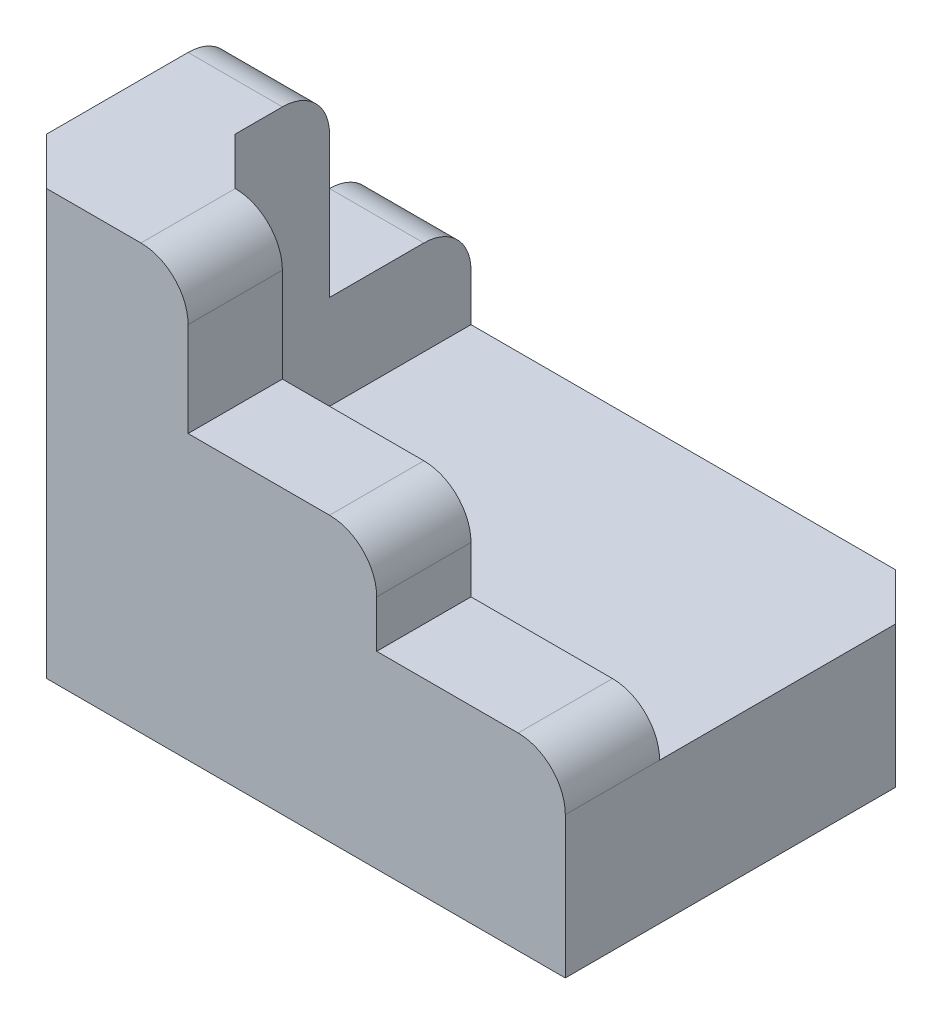
ISO-10303-21;
HEADER;
FILE_DESCRIPTION(('STEP AP214'),'2;1');
FILE_NAME('part.step','',(''),(''),'','','');
FILE_SCHEMA(('AUTOMOTIVE_DESIGN { 1 0 10303 214 1 1 1 1 }'));
ENDSEC;
DATA;
#1=APPLICATION_CONTEXT('core data for automotive mechanical design processes');
#2=APPLICATION_PROTOCOL_DEFINITION('international standard','automotive_design',2000,#1);
#3=PRODUCT_CONTEXT('',#1,'mechanical');
#4=PRODUCT('Part','Part','',(#3));
#5=PRODUCT_RELATED_PRODUCT_CATEGORY('part','',(#4));
#6=PRODUCT_DEFINITION_FORMATION('','',#4);
#7=PRODUCT_DEFINITION_CONTEXT('part definition',#1,'design');
#8=PRODUCT_DEFINITION('design','',#6,#7);
#9=PRODUCT_DEFINITION_SHAPE('','',#8);
#10=(LENGTH_UNIT() NAMED_UNIT(*) SI_UNIT(.MILLI.,.METRE.));
#11=(NAMED_UNIT(*) PLANE_ANGLE_UNIT() SI_UNIT($,.RADIAN.));
#12=(NAMED_UNIT(*) SI_UNIT($,.STERADIAN.) SOLID_ANGLE_UNIT());
#13=UNCERTAINTY_MEASURE_WITH_UNIT(LENGTH_MEASURE(1.E-05),#10,'distance_accuracy_value','');
#14=(GEOMETRIC_REPRESENTATION_CONTEXT(3) GLOBAL_UNCERTAINTY_ASSIGNED_CONTEXT((#13)) GLOBAL_UNIT_ASSIGNED_CONTEXT((#10,
#11,#12)) REPRESENTATION_CONTEXT('',''));
#15=CARTESIAN_POINT('',(0.,0.,0.));
#16=DIRECTION('',(0.,0.,1.));
#17=DIRECTION('',(1.,0.,0.));
#18=AXIS2_PLACEMENT_3D('',#15,#16,#17);
#19=CARTESIAN_POINT('',(0.,45.,-40.));
#20=DIRECTION('',(0.,0.,-1.));
#21=DIRECTION('',(-1.,0.,0.));
#22=AXIS2_PLACEMENT_3D('',#19,#20,#21);
#23=PLANE('',#22);
#24=DIRECTION('',(-1.,0.,0.));
#25=VECTOR('',#24,1.);
#26=CARTESIAN_POINT('',(0.,15.,-40.));
#27=LINE('',#26,#25);
#28=CARTESIAN_POINT('',(55.,15.,-40.));
#29=VERTEX_POINT('',#28);
#30=CARTESIAN_POINT('',(9.99999999999999,15.,-40.));
#31=VERTEX_POINT('',#30);
#32=EDGE_CURVE('E215',#29,#31,#27,.T.);
#33=ORIENTED_EDGE('',*,*,#32,.F.);
#34=DIRECTION('',(0.,-1.,0.));
#35=VECTOR('',#34,1.);
#36=CARTESIAN_POINT('',(55.,0.,-40.));
#37=LINE('',#36,#35);
#38=CARTESIAN_POINT('',(55.,0.,-40.));
#39=VERTEX_POINT('',#38);
#40=EDGE_CURVE('E326',#29,#39,#37,.T.);
#41=ORIENTED_EDGE('',*,*,#40,.T.);
#42=DIRECTION('',(1.,0.,0.));
#43=VECTOR('',#42,1.);
#44=CARTESIAN_POINT('',(0.,0.,-40.));
#45=LINE('',#44,#43);
#46=CARTESIAN_POINT('',(0.,0.,-40.));
#47=VERTEX_POINT('',#46);
#48=EDGE_CURVE('E237',#47,#39,#45,.T.);
#49=ORIENTED_EDGE('',*,*,#48,.F.);
#50=DIRECTION('',(0.,-1.,0.));
#51=VECTOR('',#50,1.);
#52=CARTESIAN_POINT('',(0.,45.,-40.));
#53=LINE('',#52,#51);
#54=CARTESIAN_POINT('',(0.,20.,-40.));
#55=VERTEX_POINT('',#54);
#56=EDGE_CURVE('E245',#55,#47,#53,.T.);
#57=ORIENTED_EDGE('',*,*,#56,.F.);
#58=DIRECTION('',(-1.,0.,0.));
#59=VECTOR('',#58,1.);
#60=CARTESIAN_POINT('',(0.,20.,-40.));
#61=LINE('',#60,#59);
#62=CARTESIAN_POINT('',(9.99999999999999,20.,-40.));
#63=VERTEX_POINT('',#62);
#64=EDGE_CURVE('E266',#55,#63,#61,.F.);
#65=ORIENTED_EDGE('',*,*,#64,.T.);
#66=DIRECTION('',(0.,1.,0.));
#67=VECTOR('',#66,1.);
#68=CARTESIAN_POINT('',(9.99999999999999,15.,-40.));
#69=LINE('',#68,#67);
#70=EDGE_CURVE('E225',#31,#63,#69,.T.);
#71=ORIENTED_EDGE('',*,*,#70,.F.);
#72=EDGE_LOOP('',(#33,#41,#49,#57,#65,#71));
#73=FACE_BOUND('',#72,.T.);
#74=ADVANCED_FACE('F35',(#73),#23,.T.);
#75=CARTESIAN_POINT('',(0.,45.,0.));
#76=DIRECTION('',(0.,1.,0.));
#77=DIRECTION('',(0.,0.,1.));
#78=AXIS2_PLACEMENT_3D('',#75,#76,#77);
#79=PLANE('',#78);
#80=DIRECTION('',(0.,0.,-1.));
#81=VECTOR('',#80,1.);
#82=CARTESIAN_POINT('',(0.,45.,0.));
#83=LINE('',#82,#81);
#84=CARTESIAN_POINT('',(0.,45.,-5.));
#85=VERTEX_POINT('',#84);
#86=CARTESIAN_POINT('',(0.,45.,-20.));
#87=VERTEX_POINT('',#86);
#88=EDGE_CURVE('E230',#85,#87,#83,.T.);
#89=ORIENTED_EDGE('',*,*,#88,.F.);
#90=DIRECTION('',(0.707106781186547,0.,0.707106781186548));
#91=VECTOR('',#90,1.);
#92=CARTESIAN_POINT('',(2.5,45.,-2.49999999999999));
#93=LINE('',#92,#91);
#94=CARTESIAN_POINT('',(4.99999999999999,45.,0.));
#95=VERTEX_POINT('',#94);
#96=EDGE_CURVE('E316',#85,#95,#93,.T.);
#97=ORIENTED_EDGE('',*,*,#96,.T.);
#98=DIRECTION('',(1.,0.,0.));
#99=VECTOR('',#98,1.);
#100=CARTESIAN_POINT('',(0.,45.,0.));
#101=LINE('',#100,#99);
#102=CARTESIAN_POINT('',(15.,45.,0.));
#103=VERTEX_POINT('',#102);
#104=EDGE_CURVE('E232',#95,#103,#101,.T.);
#105=ORIENTED_EDGE('',*,*,#104,.T.);
#106=DIRECTION('',(0.,0.,1.));
#107=VECTOR('',#106,1.);
#108=CARTESIAN_POINT('',(15.,45.,-10.));
#109=LINE('',#108,#107);
#110=CARTESIAN_POINT('',(15.,45.,-10.));
#111=VERTEX_POINT('',#110);
#112=EDGE_CURVE('E273',#103,#111,#109,.F.);
#113=ORIENTED_EDGE('',*,*,#112,.T.);
#114=DIRECTION('',(0.707106781186551,0.,0.707106781186544));
#115=VECTOR('',#114,1.);
#116=CARTESIAN_POINT('',(15.,45.,-10.));
#117=LINE('',#116,#115);
#118=CARTESIAN_POINT('',(10.,45.,-15.));
#119=VERTEX_POINT('',#118);
#120=EDGE_CURVE('E11',#111,#119,#117,.F.);
#121=ORIENTED_EDGE('',*,*,#120,.T.);
#122=DIRECTION('',(0.,0.,-1.));
#123=VECTOR('',#122,1.);
#124=CARTESIAN_POINT('',(10.,45.,0.));
#125=LINE('',#124,#123);
#126=CARTESIAN_POINT('',(10.,45.,-20.));
#127=VERTEX_POINT('',#126);
#128=EDGE_CURVE('E212',#119,#127,#125,.T.);
#129=ORIENTED_EDGE('',*,*,#128,.T.);
#130=DIRECTION('',(-1.,0.,0.));
#131=VECTOR('',#130,1.);
#132=CARTESIAN_POINT('',(0.,45.,-20.));
#133=LINE('',#132,#131);
#134=EDGE_CURVE('E276',#127,#87,#133,.T.);
#135=ORIENTED_EDGE('',*,*,#134,.T.);
#136=EDGE_LOOP('',(#89,#97,#105,#113,#121,#129,#135));
#137=FACE_BOUND('',#136,.T.);
#138=ADVANCED_FACE('F361',(#137),#79,.T.);
#139=CARTESIAN_POINT('',(0.,45.,0.));
#140=DIRECTION('',(-1.,0.,0.));
#141=DIRECTION('',(0.,0.,1.));
#142=AXIS2_PLACEMENT_3D('',#139,#140,#141);
#143=PLANE('',#142);
#144=DIRECTION('',(0.,0.,-1.));
#145=VECTOR('',#144,1.);
#146=CARTESIAN_POINT('',(0.,0.,0.));
#147=LINE('',#146,#145);
#148=CARTESIAN_POINT('',(0.,0.,-5.));
#149=VERTEX_POINT('',#148);
#150=EDGE_CURVE('E240',#149,#47,#147,.T.);
#151=ORIENTED_EDGE('',*,*,#150,.F.);
#152=DIRECTION('',(0.,1.,0.));
#153=VECTOR('',#152,1.);
#154=CARTESIAN_POINT('',(0.,45.,-5.));
#155=LINE('',#154,#153);
#156=EDGE_CURVE('E314',#149,#85,#155,.T.);
#157=ORIENTED_EDGE('',*,*,#156,.T.);
#158=ORIENTED_EDGE('',*,*,#88,.T.);
#159=CARTESIAN_POINT('',(0.,40.,-20.));
#160=DIRECTION('',(-1.,0.,0.));
#161=DIRECTION('',(0.,0.,1.));
#162=AXIS2_PLACEMENT_3D('',#159,#160,#161);
#163=CIRCLE('',#162,5.);
#164=CARTESIAN_POINT('',(0.,40.,-25.));
#165=VERTEX_POINT('',#164);
#166=EDGE_CURVE('E179',#87,#165,#163,.T.);
#167=ORIENTED_EDGE('',*,*,#166,.T.);
#168=DIRECTION('',(0.,-1.,0.));
#169=VECTOR('',#168,1.);
#170=CARTESIAN_POINT('',(0.,45.,-25.));
#171=LINE('',#170,#169);
#172=CARTESIAN_POINT('',(0.,25.,-25.));
#173=VERTEX_POINT('',#172);
#174=EDGE_CURVE('E172',#165,#173,#171,.T.);
#175=ORIENTED_EDGE('',*,*,#174,.T.);
#176=DIRECTION('',(0.,0.,-1.));
#177=VECTOR('',#176,1.);
#178=CARTESIAN_POINT('',(0.,25.,-25.));
#179=LINE('',#178,#177);
#180=CARTESIAN_POINT('',(0.,25.,-35.));
#181=VERTEX_POINT('',#180);
#182=EDGE_CURVE('E177',#173,#181,#179,.T.);
#183=ORIENTED_EDGE('',*,*,#182,.T.);
#184=CARTESIAN_POINT('',(0.,20.,-35.));
#185=DIRECTION('',(-1.,0.,0.));
#186=DIRECTION('',(0.,0.,1.));
#187=AXIS2_PLACEMENT_3D('',#184,#185,#186);
#188=CIRCLE('',#187,5.);
#189=EDGE_CURVE('E264',#181,#55,#188,.T.);
#190=ORIENTED_EDGE('',*,*,#189,.T.);
#191=ORIENTED_EDGE('',*,*,#56,.T.);
#192=EDGE_LOOP('',(#151,#157,#158,#167,#175,#183,#190,#191));
#193=FACE_BOUND('',#192,.T.);
#194=ADVANCED_FACE('F175',(#193),#143,.T.);
#195=CARTESIAN_POINT('',(10.,15.,0.));
#196=DIRECTION('',(1.,0.,0.));
#197=DIRECTION('',(0.,0.,-1.));
#198=AXIS2_PLACEMENT_3D('',#195,#196,#197);
#199=PLANE('',#198);
#200=ORIENTED_EDGE('',*,*,#128,.F.);
#201=DIRECTION('',(0.,-1.,0.));
#202=VECTOR('',#201,1.);
#203=CARTESIAN_POINT('',(10.,15.,-15.));
#204=LINE('',#203,#202);
#205=CARTESIAN_POINT('',(10.,15.,-15.));
#206=VERTEX_POINT('',#205);
#207=EDGE_CURVE('E321',#119,#206,#204,.T.);
#208=ORIENTED_EDGE('',*,*,#207,.T.);
#209=DIRECTION('',(0.,0.,-1.));
#210=VECTOR('',#209,1.);
#211=CARTESIAN_POINT('',(10.,15.,0.));
#212=LINE('',#211,#210);
#213=EDGE_CURVE('E217',#206,#31,#212,.T.);
#214=ORIENTED_EDGE('',*,*,#213,.T.);
#215=ORIENTED_EDGE('',*,*,#70,.T.);
#216=CARTESIAN_POINT('',(10.,20.,-35.));
#217=DIRECTION('',(1.,0.,0.));
#218=DIRECTION('',(0.,0.,-1.));
#219=AXIS2_PLACEMENT_3D('',#216,#217,#218);
#220=CIRCLE('',#219,5.);
#221=CARTESIAN_POINT('',(10.,25.,-35.));
#222=VERTEX_POINT('',#221);
#223=EDGE_CURVE('E271',#63,#222,#220,.T.);
#224=ORIENTED_EDGE('',*,*,#223,.T.);
#225=DIRECTION('',(0.,0.,1.));
#226=VECTOR('',#225,1.);
#227=CARTESIAN_POINT('',(10.,25.,0.));
#228=LINE('',#227,#226);
#229=CARTESIAN_POINT('',(10.,25.,-25.));
#230=VERTEX_POINT('',#229);
#231=EDGE_CURVE('E259',#222,#230,#228,.T.);
#232=ORIENTED_EDGE('',*,*,#231,.T.);
#233=DIRECTION('',(0.,1.,0.));
#234=VECTOR('',#233,1.);
#235=CARTESIAN_POINT('',(10.,15.,-25.));
#236=LINE('',#235,#234);
#237=CARTESIAN_POINT('',(10.,40.,-25.));
#238=VERTEX_POINT('',#237);
#239=EDGE_CURVE('E188',#230,#238,#236,.T.);
#240=ORIENTED_EDGE('',*,*,#239,.T.);
#241=CARTESIAN_POINT('',(10.,40.,-20.));
#242=DIRECTION('',(1.,0.,0.));
#243=DIRECTION('',(0.,0.,-1.));
#244=AXIS2_PLACEMENT_3D('',#241,#242,#243);
#245=CIRCLE('',#244,5.);
#246=EDGE_CURVE('E268',#238,#127,#245,.T.);
#247=ORIENTED_EDGE('',*,*,#246,.T.);
#248=EDGE_LOOP('',(#200,#208,#214,#215,#224,#232,#240,#247));
#249=FACE_BOUND('',#248,.T.);
#250=ADVANCED_FACE('F345',(#249),#199,.T.);
#251=CARTESIAN_POINT('',(60.,45.,0.));
#252=DIRECTION('',(-1.,0.,0.));
#253=DIRECTION('',(0.,0.,1.));
#254=AXIS2_PLACEMENT_3D('',#251,#252,#253);
#255=PLANE('',#254);
#256=DIRECTION('',(0.,0.,-1.));
#257=VECTOR('',#256,1.);
#258=CARTESIAN_POINT('',(60.,0.,0.));
#259=LINE('',#258,#257);
#260=CARTESIAN_POINT('',(60.,0.,0.));
#261=VERTEX_POINT('',#260);
#262=CARTESIAN_POINT('',(60.,0.,-35.));
#263=VERTEX_POINT('',#262);
#264=EDGE_CURVE('E229',#261,#263,#259,.T.);
#265=ORIENTED_EDGE('',*,*,#264,.T.);
#266=DIRECTION('',(0.,1.,0.));
#267=VECTOR('',#266,1.);
#268=CARTESIAN_POINT('',(60.,15.,-35.));
#269=LINE('',#268,#267);
#270=CARTESIAN_POINT('',(60.,15.,-35.));
#271=VERTEX_POINT('',#270);
#272=EDGE_CURVE('E43',#263,#271,#269,.T.);
#273=ORIENTED_EDGE('',*,*,#272,.T.);
#274=DIRECTION('',(0.,0.,-1.));
#275=VECTOR('',#274,1.);
#276=CARTESIAN_POINT('',(60.,15.,0.));
#277=LINE('',#276,#275);
#278=CARTESIAN_POINT('',(60.,15.,-10.));
#279=VERTEX_POINT('',#278);
#280=EDGE_CURVE('E223',#279,#271,#277,.T.);
#281=ORIENTED_EDGE('',*,*,#280,.F.);
#282=DIRECTION('',(0.,0.,1.));
#283=VECTOR('',#282,1.);
#284=CARTESIAN_POINT('',(60.,15.,0.));
#285=LINE('',#284,#283);
#286=CARTESIAN_POINT('',(60.,15.,0.));
#287=VERTEX_POINT('',#286);
#288=EDGE_CURVE('E302',#279,#287,#285,.T.);
#289=ORIENTED_EDGE('',*,*,#288,.T.);
#290=DIRECTION('',(0.,-1.,0.));
#291=VECTOR('',#290,1.);
#292=CARTESIAN_POINT('',(60.,45.,0.));
#293=LINE('',#292,#291);
#294=EDGE_CURVE('E235',#287,#261,#293,.T.);
#295=ORIENTED_EDGE('',*,*,#294,.T.);
#296=EDGE_LOOP('',(#265,#273,#281,#289,#295));
#297=FACE_BOUND('',#296,.T.);
#298=ADVANCED_FACE('F395',(#297),#255,.F.);
#299=CARTESIAN_POINT('',(0.,45.,0.));
#300=DIRECTION('',(0.,0.,-1.));
#301=DIRECTION('',(-1.,0.,0.));
#302=AXIS2_PLACEMENT_3D('',#299,#300,#301);
#303=PLANE('',#302);
#304=ORIENTED_EDGE('',*,*,#104,.F.);
#305=DIRECTION('',(0.,-1.,0.));
#306=VECTOR('',#305,1.);
#307=CARTESIAN_POINT('',(4.99999999999999,0.,0.));
#308=LINE('',#307,#306);
#309=CARTESIAN_POINT('',(4.99999999999999,0.,0.));
#310=VERTEX_POINT('',#309);
#311=EDGE_CURVE('E307',#95,#310,#308,.T.);
#312=ORIENTED_EDGE('',*,*,#311,.T.);
#313=DIRECTION('',(1.,0.,0.));
#314=VECTOR('',#313,1.);
#315=CARTESIAN_POINT('',(0.,0.,0.));
#316=LINE('',#315,#314);
#317=EDGE_CURVE('E233',#310,#261,#316,.T.);
#318=ORIENTED_EDGE('',*,*,#317,.T.);
#319=ORIENTED_EDGE('',*,*,#294,.F.);
#320=CARTESIAN_POINT('',(55.,15.,0.));
#321=DIRECTION('',(0.,0.,-1.));
#322=DIRECTION('',(-1.,0.,0.));
#323=AXIS2_PLACEMENT_3D('',#320,#321,#322);
#324=CIRCLE('',#323,5.);
#325=CARTESIAN_POINT('',(55.,20.,0.));
#326=VERTEX_POINT('',#325);
#327=EDGE_CURVE('E284',#287,#326,#324,.F.);
#328=ORIENTED_EDGE('',*,*,#327,.T.);
#329=DIRECTION('',(1.,0.,0.));
#330=VECTOR('',#329,1.);
#331=CARTESIAN_POINT('',(0.,20.,0.));
#332=LINE('',#331,#330);
#333=CARTESIAN_POINT('',(40.,20.,0.));
#334=VERTEX_POINT('',#333);
#335=EDGE_CURVE('E205',#334,#326,#332,.T.);
#336=ORIENTED_EDGE('',*,*,#335,.F.);
#337=DIRECTION('',(0.,-1.,0.));
#338=VECTOR('',#337,1.);
#339=CARTESIAN_POINT('',(40.,0.,0.));
#340=LINE('',#339,#338);
#341=CARTESIAN_POINT('',(40.,25.,0.));
#342=VERTEX_POINT('',#341);
#343=EDGE_CURVE('E203',#342,#334,#340,.T.);
#344=ORIENTED_EDGE('',*,*,#343,.F.);
#345=CARTESIAN_POINT('',(35.,25.,0.));
#346=DIRECTION('',(0.,0.,-1.));
#347=DIRECTION('',(-1.,0.,0.));
#348=AXIS2_PLACEMENT_3D('',#345,#346,#347);
#349=CIRCLE('',#348,5.);
#350=CARTESIAN_POINT('',(35.,30.,0.));
#351=VERTEX_POINT('',#350);
#352=EDGE_CURVE('E286',#342,#351,#349,.F.);
#353=ORIENTED_EDGE('',*,*,#352,.T.);
#354=DIRECTION('',(-1.,0.,0.));
#355=VECTOR('',#354,1.);
#356=CARTESIAN_POINT('',(0.,30.,0.));
#357=LINE('',#356,#355);
#358=CARTESIAN_POINT('',(20.,30.,0.));
#359=VERTEX_POINT('',#358);
#360=EDGE_CURVE('E201',#351,#359,#357,.T.);
#361=ORIENTED_EDGE('',*,*,#360,.T.);
#362=DIRECTION('',(0.,-1.,0.));
#363=VECTOR('',#362,1.);
#364=CARTESIAN_POINT('',(20.,0.,0.));
#365=LINE('',#364,#363);
#366=CARTESIAN_POINT('',(20.,40.,0.));
#367=VERTEX_POINT('',#366);
#368=EDGE_CURVE('E191',#367,#359,#365,.T.);
#369=ORIENTED_EDGE('',*,*,#368,.F.);
#370=CARTESIAN_POINT('',(15.,40.,0.));
#371=DIRECTION('',(0.,0.,-1.));
#372=DIRECTION('',(-1.,0.,0.));
#373=AXIS2_PLACEMENT_3D('',#370,#371,#372);
#374=CIRCLE('',#373,5.);
#375=EDGE_CURVE('E288',#367,#103,#374,.F.);
#376=ORIENTED_EDGE('',*,*,#375,.T.);
#377=EDGE_LOOP('',(#304,#312,#318,#319,#328,#336,#344,#353,#361,#369,#376));
#378=FACE_BOUND('',#377,.T.);
#379=ADVANCED_FACE('F370',(#378),#303,.F.);
#380=CARTESIAN_POINT('',(0.,0.,0.));
#381=DIRECTION('',(0.,1.,0.));
#382=DIRECTION('',(0.,0.,1.));
#383=AXIS2_PLACEMENT_3D('',#380,#381,#382);
#384=PLANE('',#383);
#385=ORIENTED_EDGE('',*,*,#317,.F.);
#386=DIRECTION('',(-0.707106781186547,0.,-0.707106781186548));
#387=VECTOR('',#386,1.);
#388=CARTESIAN_POINT('',(4.99999999999999,0.,0.));
#389=LINE('',#388,#387);
#390=EDGE_CURVE('E312',#310,#149,#389,.T.);
#391=ORIENTED_EDGE('',*,*,#390,.T.);
#392=ORIENTED_EDGE('',*,*,#150,.T.);
#393=ORIENTED_EDGE('',*,*,#48,.T.);
#394=DIRECTION('',(0.707106781186546,0.,0.707106781186549));
#395=VECTOR('',#394,1.);
#396=CARTESIAN_POINT('',(55.,0.,-40.));
#397=LINE('',#396,#395);
#398=EDGE_CURVE('E310',#39,#263,#397,.T.);
#399=ORIENTED_EDGE('',*,*,#398,.T.);
#400=ORIENTED_EDGE('',*,*,#264,.F.);
#401=EDGE_LOOP('',(#385,#391,#392,#393,#399,#400));
#402=FACE_BOUND('',#401,.T.);
#403=ADVANCED_FACE('F336',(#402),#384,.F.);
#404=CARTESIAN_POINT('',(0.,15.,-10.));
#405=DIRECTION('',(0.,0.,-1.));
#406=DIRECTION('',(-1.,0.,0.));
#407=AXIS2_PLACEMENT_3D('',#404,#405,#406);
#408=PLANE('',#407);
#409=DIRECTION('',(-1.,0.,0.));
#410=VECTOR('',#409,1.);
#411=CARTESIAN_POINT('',(0.,15.,-10.));
#412=LINE('',#411,#410);
#413=CARTESIAN_POINT('',(15.,15.,-10.));
#414=VERTEX_POINT('',#413);
#415=EDGE_CURVE('E220',#279,#414,#412,.T.);
#416=ORIENTED_EDGE('',*,*,#415,.T.);
#417=DIRECTION('',(0.,1.,0.));
#418=VECTOR('',#417,1.);
#419=CARTESIAN_POINT('',(15.,45.,-10.));
#420=LINE('',#419,#418);
#421=EDGE_CURVE('E318',#414,#111,#420,.T.);
#422=ORIENTED_EDGE('',*,*,#421,.T.);
#423=CARTESIAN_POINT('',(15.,40.,-10.));
#424=DIRECTION('',(0.,0.,-1.));
#425=DIRECTION('',(-1.,0.,0.));
#426=AXIS2_PLACEMENT_3D('',#423,#424,#425);
#427=CIRCLE('',#426,5.);
#428=CARTESIAN_POINT('',(20.,40.,-10.));
#429=VERTEX_POINT('',#428);
#430=EDGE_CURVE('E295',#111,#429,#427,.T.);
#431=ORIENTED_EDGE('',*,*,#430,.T.);
#432=DIRECTION('',(0.,1.,0.));
#433=VECTOR('',#432,1.);
#434=CARTESIAN_POINT('',(20.,15.,-10.));
#435=LINE('',#434,#433);
#436=CARTESIAN_POINT('',(20.,30.,-10.));
#437=VERTEX_POINT('',#436);
#438=EDGE_CURVE('E248',#437,#429,#435,.T.);
#439=ORIENTED_EDGE('',*,*,#438,.F.);
#440=DIRECTION('',(1.,0.,0.));
#441=VECTOR('',#440,1.);
#442=CARTESIAN_POINT('',(0.,30.,-10.));
#443=LINE('',#442,#441);
#444=CARTESIAN_POINT('',(35.,30.,-10.));
#445=VERTEX_POINT('',#444);
#446=EDGE_CURVE('E251',#437,#445,#443,.T.);
#447=ORIENTED_EDGE('',*,*,#446,.T.);
#448=CARTESIAN_POINT('',(35.,25.,-10.));
#449=DIRECTION('',(0.,0.,-1.));
#450=DIRECTION('',(-1.,0.,0.));
#451=AXIS2_PLACEMENT_3D('',#448,#449,#450);
#452=CIRCLE('',#451,5.);
#453=CARTESIAN_POINT('',(40.,25.,-10.));
#454=VERTEX_POINT('',#453);
#455=EDGE_CURVE('E293',#445,#454,#452,.T.);
#456=ORIENTED_EDGE('',*,*,#455,.T.);
#457=DIRECTION('',(0.,1.,0.));
#458=VECTOR('',#457,1.);
#459=CARTESIAN_POINT('',(40.,15.,-10.));
#460=LINE('',#459,#458);
#461=CARTESIAN_POINT('',(40.,20.,-10.));
#462=VERTEX_POINT('',#461);
#463=EDGE_CURVE('E254',#462,#454,#460,.T.);
#464=ORIENTED_EDGE('',*,*,#463,.F.);
#465=DIRECTION('',(-1.,0.,0.));
#466=VECTOR('',#465,1.);
#467=CARTESIAN_POINT('',(0.,20.,-10.));
#468=LINE('',#467,#466);
#469=CARTESIAN_POINT('',(55.,20.,-10.));
#470=VERTEX_POINT('',#469);
#471=EDGE_CURVE('E257',#470,#462,#468,.T.);
#472=ORIENTED_EDGE('',*,*,#471,.F.);
#473=CARTESIAN_POINT('',(55.,15.,-10.));
#474=DIRECTION('',(0.,0.,-1.));
#475=DIRECTION('',(-1.,0.,0.));
#476=AXIS2_PLACEMENT_3D('',#473,#474,#475);
#477=CIRCLE('',#476,5.);
#478=EDGE_CURVE('E291',#470,#279,#477,.T.);
#479=ORIENTED_EDGE('',*,*,#478,.T.);
#480=EDGE_LOOP('',(#416,#422,#431,#439,#447,#456,#464,#472,#479));
#481=FACE_BOUND('',#480,.T.);
#482=ADVANCED_FACE('F355',(#481),#408,.T.);
#483=CARTESIAN_POINT('',(0.,15.,0.));
#484=DIRECTION('',(0.,-1.,0.));
#485=DIRECTION('',(0.,0.,-1.));
#486=AXIS2_PLACEMENT_3D('',#483,#484,#485);
#487=PLANE('',#486);
#488=ORIENTED_EDGE('',*,*,#213,.F.);
#489=DIRECTION('',(-0.707106781186551,0.,-0.707106781186544));
#490=VECTOR('',#489,1.);
#491=CARTESIAN_POINT('',(15.,15.,-10.));
#492=LINE('',#491,#490);
#493=EDGE_CURVE('E324',#206,#414,#492,.F.);
#494=ORIENTED_EDGE('',*,*,#493,.T.);
#495=ORIENTED_EDGE('',*,*,#415,.F.);
#496=ORIENTED_EDGE('',*,*,#280,.T.);
#497=DIRECTION('',(-0.707106781186546,0.,-0.707106781186549));
#498=VECTOR('',#497,1.);
#499=CARTESIAN_POINT('',(55.,15.,-40.));
#500=LINE('',#499,#498);
#501=EDGE_CURVE('E56',#271,#29,#500,.T.);
#502=ORIENTED_EDGE('',*,*,#501,.T.);
#503=ORIENTED_EDGE('',*,*,#32,.T.);
#504=EDGE_LOOP('',(#488,#494,#495,#496,#502,#503));
#505=FACE_BOUND('',#504,.T.);
#506=ADVANCED_FACE('F349',(#505),#487,.F.);
#507=CARTESIAN_POINT('',(0.,20.,-30.));
#508=DIRECTION('',(0.,-1.,0.));
#509=DIRECTION('',(0.,0.,-1.));
#510=AXIS2_PLACEMENT_3D('',#507,#508,#509);
#511=PLANE('',#510);
#512=ORIENTED_EDGE('',*,*,#335,.T.);
#513=DIRECTION('',(0.,0.,1.));
#514=VECTOR('',#513,1.);
#515=CARTESIAN_POINT('',(55.,20.,-30.));
#516=LINE('',#515,#514);
#517=EDGE_CURVE('E305',#326,#470,#516,.F.);
#518=ORIENTED_EDGE('',*,*,#517,.T.);
#519=ORIENTED_EDGE('',*,*,#471,.T.);
#520=DIRECTION('',(0.,0.,1.));
#521=VECTOR('',#520,1.);
#522=CARTESIAN_POINT('',(40.,20.,-30.));
#523=LINE('',#522,#521);
#524=EDGE_CURVE('E209',#462,#334,#523,.T.);
#525=ORIENTED_EDGE('',*,*,#524,.T.);
#526=EDGE_LOOP('',(#512,#518,#519,#525));
#527=FACE_BOUND('',#526,.T.);
#528=ADVANCED_FACE('F388',(#527),#511,.F.);
#529=CARTESIAN_POINT('',(40.,0.,-30.));
#530=DIRECTION('',(-1.,0.,0.));
#531=DIRECTION('',(0.,0.,1.));
#532=AXIS2_PLACEMENT_3D('',#529,#530,#531);
#533=PLANE('',#532);
#534=ORIENTED_EDGE('',*,*,#463,.T.);
#535=DIRECTION('',(0.,0.,1.));
#536=VECTOR('',#535,1.);
#537=CARTESIAN_POINT('',(40.,25.,0.));
#538=LINE('',#537,#536);
#539=EDGE_CURVE('E297',#454,#342,#538,.T.);
#540=ORIENTED_EDGE('',*,*,#539,.T.);
#541=ORIENTED_EDGE('',*,*,#343,.T.);
#542=ORIENTED_EDGE('',*,*,#524,.F.);
#543=EDGE_LOOP('',(#534,#540,#541,#542));
#544=FACE_BOUND('',#543,.T.);
#545=ADVANCED_FACE('F385',(#544),#533,.F.);
#546=CARTESIAN_POINT('',(0.,30.,-30.));
#547=DIRECTION('',(0.,1.,0.));
#548=DIRECTION('',(-1.,0.,0.));
#549=AXIS2_PLACEMENT_3D('',#546,#547,#548);
#550=PLANE('',#549);
#551=ORIENTED_EDGE('',*,*,#360,.F.);
#552=DIRECTION('',(0.,0.,1.));
#553=VECTOR('',#552,1.);
#554=CARTESIAN_POINT('',(35.,30.,-10.));
#555=LINE('',#554,#553);
#556=EDGE_CURVE('E300',#351,#445,#555,.F.);
#557=ORIENTED_EDGE('',*,*,#556,.T.);
#558=ORIENTED_EDGE('',*,*,#446,.F.);
#559=DIRECTION('',(0.,0.,1.));
#560=VECTOR('',#559,1.);
#561=CARTESIAN_POINT('',(20.,30.,-30.));
#562=LINE('',#561,#560);
#563=EDGE_CURVE('E208',#437,#359,#562,.T.);
#564=ORIENTED_EDGE('',*,*,#563,.T.);
#565=EDGE_LOOP('',(#551,#557,#558,#564));
#566=FACE_BOUND('',#565,.T.);
#567=ADVANCED_FACE('F375',(#566),#550,.T.);
#568=CARTESIAN_POINT('',(20.,0.,-30.));
#569=DIRECTION('',(-1.,0.,0.));
#570=DIRECTION('',(0.,-1.,0.));
#571=AXIS2_PLACEMENT_3D('',#568,#569,#570);
#572=PLANE('',#571);
#573=ORIENTED_EDGE('',*,*,#438,.T.);
#574=DIRECTION('',(0.,0.,1.));
#575=VECTOR('',#574,1.);
#576=CARTESIAN_POINT('',(20.,40.,0.));
#577=LINE('',#576,#575);
#578=EDGE_CURVE('E281',#429,#367,#577,.T.);
#579=ORIENTED_EDGE('',*,*,#578,.T.);
#580=ORIENTED_EDGE('',*,*,#368,.T.);
#581=ORIENTED_EDGE('',*,*,#563,.F.);
#582=EDGE_LOOP('',(#573,#579,#580,#581));
#583=FACE_BOUND('',#582,.T.);
#584=ADVANCED_FACE('F368',(#583),#572,.F.);
#585=CARTESIAN_POINT('',(30.,45.,-25.));
#586=DIRECTION('',(0.,0.,-1.));
#587=DIRECTION('',(-1.,0.,0.));
#588=AXIS2_PLACEMENT_3D('',#585,#586,#587);
#589=PLANE('',#588);
#590=ORIENTED_EDGE('',*,*,#174,.F.);
#591=DIRECTION('',(-1.,0.,0.));
#592=VECTOR('',#591,1.);
#593=CARTESIAN_POINT('',(30.,40.,-25.));
#594=LINE('',#593,#592);
#595=EDGE_CURVE('E279',#165,#238,#594,.F.);
#596=ORIENTED_EDGE('',*,*,#595,.T.);
#597=ORIENTED_EDGE('',*,*,#239,.F.);
#598=DIRECTION('',(-1.,0.,0.));
#599=VECTOR('',#598,1.);
#600=CARTESIAN_POINT('',(30.,25.,-25.));
#601=LINE('',#600,#599);
#602=EDGE_CURVE('E185',#230,#173,#601,.T.);
#603=ORIENTED_EDGE('',*,*,#602,.T.);
#604=EDGE_LOOP('',(#590,#596,#597,#603));
#605=FACE_BOUND('',#604,.T.);
#606=ADVANCED_FACE('F186',(#605),#589,.T.);
#607=CARTESIAN_POINT('',(30.,25.,-25.));
#608=DIRECTION('',(0.,1.,0.));
#609=DIRECTION('',(0.,0.,1.));
#610=AXIS2_PLACEMENT_3D('',#607,#608,#609);
#611=PLANE('',#610);
#612=ORIENTED_EDGE('',*,*,#231,.F.);
#613=DIRECTION('',(-1.,0.,0.));
#614=VECTOR('',#613,1.);
#615=CARTESIAN_POINT('',(30.,25.,-35.));
#616=LINE('',#615,#614);
#617=EDGE_CURVE('E196',#222,#181,#616,.T.);
#618=ORIENTED_EDGE('',*,*,#617,.T.);
#619=ORIENTED_EDGE('',*,*,#182,.F.);
#620=ORIENTED_EDGE('',*,*,#602,.F.);
#621=EDGE_LOOP('',(#612,#618,#619,#620));
#622=FACE_BOUND('',#621,.T.);
#623=ADVANCED_FACE('F194',(#622),#611,.T.);
#624=CARTESIAN_POINT('',(30.,20.,-35.));
#625=DIRECTION('',(-1.,0.,0.));
#626=DIRECTION('',(0.,0.,1.));
#627=AXIS2_PLACEMENT_3D('',#624,#625,#626);
#628=CYLINDRICAL_SURFACE('',#627,5.);
#629=ORIENTED_EDGE('',*,*,#223,.F.);
#630=ORIENTED_EDGE('',*,*,#64,.F.);
#631=ORIENTED_EDGE('',*,*,#189,.F.);
#632=ORIENTED_EDGE('',*,*,#617,.F.);
#633=EDGE_LOOP('',(#629,#630,#631,#632));
#634=FACE_BOUND('',#633,.T.);
#635=ADVANCED_FACE('F342',(#634),#628,.T.);
#636=CARTESIAN_POINT('',(0.,40.,-20.));
#637=DIRECTION('',(-1.,0.,0.));
#638=DIRECTION('',(0.,0.,1.));
#639=AXIS2_PLACEMENT_3D('',#636,#637,#638);
#640=CYLINDRICAL_SURFACE('',#639,5.);
#641=ORIENTED_EDGE('',*,*,#246,.F.);
#642=ORIENTED_EDGE('',*,*,#595,.F.);
#643=ORIENTED_EDGE('',*,*,#166,.F.);
#644=ORIENTED_EDGE('',*,*,#134,.F.);
#645=EDGE_LOOP('',(#641,#642,#643,#644));
#646=FACE_BOUND('',#645,.T.);
#647=ADVANCED_FACE('F414',(#646),#640,.T.);
#648=CARTESIAN_POINT('',(15.,40.,-30.));
#649=DIRECTION('',(0.,0.,-1.));
#650=DIRECTION('',(-1.,0.,0.));
#651=AXIS2_PLACEMENT_3D('',#648,#649,#650);
#652=CYLINDRICAL_SURFACE('',#651,5.);
#653=ORIENTED_EDGE('',*,*,#430,.F.);
#654=ORIENTED_EDGE('',*,*,#112,.F.);
#655=ORIENTED_EDGE('',*,*,#375,.F.);
#656=ORIENTED_EDGE('',*,*,#578,.F.);
#657=EDGE_LOOP('',(#653,#654,#655,#656));
#658=FACE_BOUND('',#657,.T.);
#659=ADVANCED_FACE('F365',(#658),#652,.T.);
#660=CARTESIAN_POINT('',(35.,25.,-30.));
#661=DIRECTION('',(0.,0.,-1.));
#662=DIRECTION('',(-1.,0.,0.));
#663=AXIS2_PLACEMENT_3D('',#660,#661,#662);
#664=CYLINDRICAL_SURFACE('',#663,5.);
#665=ORIENTED_EDGE('',*,*,#455,.F.);
#666=ORIENTED_EDGE('',*,*,#556,.F.);
#667=ORIENTED_EDGE('',*,*,#352,.F.);
#668=ORIENTED_EDGE('',*,*,#539,.F.);
#669=EDGE_LOOP('',(#665,#666,#667,#668));
#670=FACE_BOUND('',#669,.T.);
#671=ADVANCED_FACE('F379',(#670),#664,.T.);
#672=CARTESIAN_POINT('',(55.,15.,0.));
#673=DIRECTION('',(0.,0.,1.));
#674=DIRECTION('',(1.,0.,0.));
#675=AXIS2_PLACEMENT_3D('',#672,#673,#674);
#676=CYLINDRICAL_SURFACE('',#675,5.);
#677=ORIENTED_EDGE('',*,*,#478,.F.);
#678=ORIENTED_EDGE('',*,*,#517,.F.);
#679=ORIENTED_EDGE('',*,*,#327,.F.);
#680=ORIENTED_EDGE('',*,*,#288,.F.);
#681=EDGE_LOOP('',(#677,#678,#679,#680));
#682=FACE_BOUND('',#681,.T.);
#683=ADVANCED_FACE('F394',(#682),#676,.T.);
#684=CARTESIAN_POINT('',(4.99999999999999,45.,0.));
#685=DIRECTION('',(-0.707106781186548,0.,0.707106781186546));
#686=DIRECTION('',(0.,1.,0.));
#687=AXIS2_PLACEMENT_3D('',#684,#685,#686);
#688=PLANE('',#687);
#689=ORIENTED_EDGE('',*,*,#96,.F.);
#690=ORIENTED_EDGE('',*,*,#156,.F.);
#691=ORIENTED_EDGE('',*,*,#390,.F.);
#692=ORIENTED_EDGE('',*,*,#311,.F.);
#693=EDGE_LOOP('',(#689,#690,#691,#692));
#694=FACE_BOUND('',#693,.T.);
#695=ADVANCED_FACE('F400',(#694),#688,.T.);
#696=CARTESIAN_POINT('',(15.,15.,-10.));
#697=DIRECTION('',(0.707106781186544,0.,-0.707106781186551));
#698=DIRECTION('',(0.,-1.,0.));
#699=AXIS2_PLACEMENT_3D('',#696,#697,#698);
#700=PLANE('',#699);
#701=ORIENTED_EDGE('',*,*,#493,.F.);
#702=ORIENTED_EDGE('',*,*,#207,.F.);
#703=ORIENTED_EDGE('',*,*,#120,.F.);
#704=ORIENTED_EDGE('',*,*,#421,.F.);
#705=EDGE_LOOP('',(#701,#702,#703,#704));
#706=FACE_BOUND('',#705,.T.);
#707=ADVANCED_FACE('F353',(#706),#700,.T.);
#708=CARTESIAN_POINT('',(55.,45.,-40.));
#709=DIRECTION('',(0.707106781186549,0.,-0.707106781186546));
#710=DIRECTION('',(0.,1.,0.));
#711=AXIS2_PLACEMENT_3D('',#708,#709,#710);
#712=PLANE('',#711);
#713=ORIENTED_EDGE('',*,*,#501,.F.);
#714=ORIENTED_EDGE('',*,*,#272,.F.);
#715=ORIENTED_EDGE('',*,*,#398,.F.);
#716=ORIENTED_EDGE('',*,*,#40,.F.);
#717=EDGE_LOOP('',(#713,#714,#715,#716));
#718=FACE_BOUND('',#717,.T.);
#719=ADVANCED_FACE('F37',(#718),#712,.T.);
#720=CLOSED_SHELL('',(#74,#138,#194,#250,#298,#379,#403,#482,#506,#528,#545,#567,#584,#606,#623,
#635,#647,#659,#671,#683,#695,#707,#719));
#721=MANIFOLD_SOLID_BREP('B2',#720);
#722=ADVANCED_BREP_SHAPE_REPRESENTATION('',(#18,#721),#14);
#723=SHAPE_DEFINITION_REPRESENTATION(#9,#722);
ENDSEC;
END-ISO-10303-21;
